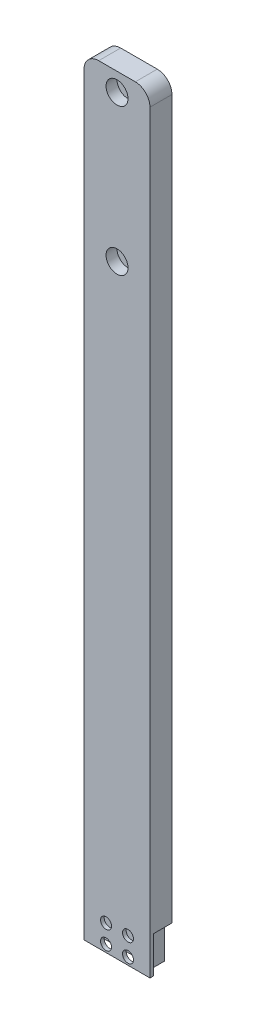
ISO-10303-21;
HEADER;
FILE_DESCRIPTION(('STEP AP214'),'2;1');
FILE_NAME('part.step','',(''),(''),'','','');
FILE_SCHEMA(('AUTOMOTIVE_DESIGN { 1 0 10303 214 1 1 1 1 }'));
ENDSEC;
DATA;
#1=APPLICATION_CONTEXT('core data for automotive mechanical design processes');
#2=APPLICATION_PROTOCOL_DEFINITION('international standard','automotive_design',2000,#1);
#3=PRODUCT_CONTEXT('',#1,'mechanical');
#4=PRODUCT('Part','Part','',(#3));
#5=PRODUCT_RELATED_PRODUCT_CATEGORY('part','',(#4));
#6=PRODUCT_DEFINITION_FORMATION('','',#4);
#7=PRODUCT_DEFINITION_CONTEXT('part definition',#1,'design');
#8=PRODUCT_DEFINITION('design','',#6,#7);
#9=PRODUCT_DEFINITION_SHAPE('','',#8);
#10=(LENGTH_UNIT() NAMED_UNIT(*) SI_UNIT(.MILLI.,.METRE.));
#11=(NAMED_UNIT(*) PLANE_ANGLE_UNIT() SI_UNIT($,.RADIAN.));
#12=(NAMED_UNIT(*) SI_UNIT($,.STERADIAN.) SOLID_ANGLE_UNIT());
#13=UNCERTAINTY_MEASURE_WITH_UNIT(LENGTH_MEASURE(1.E-05),#10,'distance_accuracy_value','');
#14=(GEOMETRIC_REPRESENTATION_CONTEXT(3) GLOBAL_UNCERTAINTY_ASSIGNED_CONTEXT((#13)) GLOBAL_UNIT_ASSIGNED_CONTEXT((#10,
#11,#12)) REPRESENTATION_CONTEXT('',''));
#15=CARTESIAN_POINT('',(0.,0.,0.));
#16=DIRECTION('',(0.,0.,1.));
#17=DIRECTION('',(1.,0.,0.));
#18=AXIS2_PLACEMENT_3D('',#15,#16,#17);
#19=CARTESIAN_POINT('',(-33.0923076923077,101.830769230769,6.));
#20=DIRECTION('',(0.,0.,-1.));
#21=DIRECTION('',(-1.,0.,0.));
#22=AXIS2_PLACEMENT_3D('',#19,#20,#21);
#23=CYLINDRICAL_SURFACE('',#22,3.);
#24=CARTESIAN_POINT('',(-33.0923076923077,101.830769230769,6.));
#25=DIRECTION('',(0.,0.,1.));
#26=DIRECTION('',(1.,0.,0.));
#27=AXIS2_PLACEMENT_3D('',#24,#25,#26);
#28=CIRCLE('',#27,3.);
#29=CARTESIAN_POINT('',(-30.0923076923077,101.830769230769,6.));
#30=VERTEX_POINT('',#29);
#31=EDGE_CURVE('E188',#30,#30,#28,.T.);
#32=ORIENTED_EDGE('',*,*,#31,.T.);
#33=EDGE_LOOP('',(#32));
#34=FACE_BOUND('',#33,.T.);
#35=CARTESIAN_POINT('',(-33.0923076923077,101.830769230769,3.00000000000002));
#36=DIRECTION('',(0.,0.,-1.));
#37=DIRECTION('',(-1.,0.,0.));
#38=AXIS2_PLACEMENT_3D('',#35,#36,#37);
#39=CIRCLE('',#38,2.99999999999999);
#40=CARTESIAN_POINT('',(-36.0923076923077,101.830769230769,3.00000000000002));
#41=VERTEX_POINT('',#40);
#42=EDGE_CURVE('E576',#41,#41,#39,.T.);
#43=ORIENTED_EDGE('',*,*,#42,.T.);
#44=EDGE_LOOP('',(#43));
#45=FACE_BOUND('',#44,.T.);
#46=ADVANCED_FACE('F33',(#34,#45),#23,.F.);
#47=CARTESIAN_POINT('',(-33.0923076923077,141.830769230769,6.));
#48=DIRECTION('',(0.,0.,-1.));
#49=DIRECTION('',(-1.,0.,0.));
#50=AXIS2_PLACEMENT_3D('',#47,#48,#49);
#51=CYLINDRICAL_SURFACE('',#50,3.);
#52=CARTESIAN_POINT('',(-33.0923076923077,141.830769230769,6.));
#53=DIRECTION('',(0.,0.,1.));
#54=DIRECTION('',(1.,0.,0.));
#55=AXIS2_PLACEMENT_3D('',#52,#53,#54);
#56=CIRCLE('',#55,3.);
#57=CARTESIAN_POINT('',(-30.0923076923077,141.830769230769,6.));
#58=VERTEX_POINT('',#57);
#59=EDGE_CURVE('E191',#58,#58,#56,.T.);
#60=ORIENTED_EDGE('',*,*,#59,.T.);
#61=EDGE_LOOP('',(#60));
#62=FACE_BOUND('',#61,.T.);
#63=CARTESIAN_POINT('',(-33.0923076923077,141.830769230769,3.00000000000002));
#64=DIRECTION('',(0.,0.,-1.));
#65=DIRECTION('',(-1.,0.,0.));
#66=AXIS2_PLACEMENT_3D('',#63,#64,#65);
#67=CIRCLE('',#66,2.99999999999999);
#68=CARTESIAN_POINT('',(-36.0923076923077,141.830769230769,3.00000000000002));
#69=VERTEX_POINT('',#68);
#70=EDGE_CURVE('E573',#69,#69,#67,.T.);
#71=ORIENTED_EDGE('',*,*,#70,.T.);
#72=EDGE_LOOP('',(#71));
#73=FACE_BOUND('',#72,.T.);
#74=ADVANCED_FACE('F293',(#62,#73),#51,.F.);
#75=CARTESIAN_POINT('',(-42.0923076923077,-53.1692307692308,6.));
#76=DIRECTION('',(0.,1.,0.));
#77=DIRECTION('',(0.,0.,1.));
#78=AXIS2_PLACEMENT_3D('',#75,#76,#77);
#79=PLANE('',#78);
#80=DIRECTION('',(-1.,0.,0.));
#81=VECTOR('',#80,1.);
#82=CARTESIAN_POINT('',(-42.0923076923077,-53.1692307692308,5.));
#83=LINE('',#82,#81);
#84=CARTESIAN_POINT('',(-24.0923076923077,-53.1692307692308,5.));
#85=VERTEX_POINT('',#84);
#86=CARTESIAN_POINT('',(-42.0923076923077,-53.1692307692308,5.));
#87=VERTEX_POINT('',#86);
#88=EDGE_CURVE('E135',#85,#87,#83,.T.);
#89=ORIENTED_EDGE('',*,*,#88,.T.);
#90=DIRECTION('',(0.,0.,-1.));
#91=VECTOR('',#90,1.);
#92=CARTESIAN_POINT('',(-42.0923076923077,-53.1692307692308,6.));
#93=LINE('',#92,#91);
#94=CARTESIAN_POINT('',(-42.0923076923077,-53.1692307692308,0.));
#95=VERTEX_POINT('',#94);
#96=EDGE_CURVE('E148',#87,#95,#93,.T.);
#97=ORIENTED_EDGE('',*,*,#96,.T.);
#98=DIRECTION('',(1.,0.,0.));
#99=VECTOR('',#98,1.);
#100=CARTESIAN_POINT('',(-42.0923076923077,-53.1692307692308,0.));
#101=LINE('',#100,#99);
#102=CARTESIAN_POINT('',(-40.0923076923077,-53.1692307692308,0.));
#103=VERTEX_POINT('',#102);
#104=EDGE_CURVE('E205',#95,#103,#101,.T.);
#105=ORIENTED_EDGE('',*,*,#104,.T.);
#106=DIRECTION('',(0.,0.,-1.));
#107=VECTOR('',#106,1.);
#108=CARTESIAN_POINT('',(-40.0923076923077,-53.1692307692308,0.));
#109=LINE('',#108,#107);
#110=CARTESIAN_POINT('',(-40.0923076923077,-53.1692307692308,3.));
#111=VERTEX_POINT('',#110);
#112=EDGE_CURVE('E173',#111,#103,#109,.T.);
#113=ORIENTED_EDGE('',*,*,#112,.F.);
#114=DIRECTION('',(-1.,0.,0.));
#115=VECTOR('',#114,1.);
#116=CARTESIAN_POINT('',(0.,-53.1692307692308,3.));
#117=LINE('',#116,#115);
#118=CARTESIAN_POINT('',(-26.0923076923077,-53.1692307692308,3.));
#119=VERTEX_POINT('',#118);
#120=EDGE_CURVE('E157',#119,#111,#117,.T.);
#121=ORIENTED_EDGE('',*,*,#120,.F.);
#122=DIRECTION('',(0.,0.,-1.));
#123=VECTOR('',#122,1.);
#124=CARTESIAN_POINT('',(-26.0923076923077,-53.1692307692308,0.));
#125=LINE('',#124,#123);
#126=CARTESIAN_POINT('',(-26.0923076923077,-53.1692307692308,0.));
#127=VERTEX_POINT('',#126);
#128=EDGE_CURVE('E163',#119,#127,#125,.T.);
#129=ORIENTED_EDGE('',*,*,#128,.T.);
#130=CARTESIAN_POINT('',(-24.0923076923077,-53.1692307692308,0.));
#131=VERTEX_POINT('',#130);
#132=EDGE_CURVE('E204',#127,#131,#101,.T.);
#133=ORIENTED_EDGE('',*,*,#132,.T.);
#134=DIRECTION('',(0.,0.,-1.));
#135=VECTOR('',#134,1.);
#136=CARTESIAN_POINT('',(-24.0923076923077,-53.1692307692308,6.));
#137=LINE('',#136,#135);
#138=EDGE_CURVE('E202',#85,#131,#137,.T.);
#139=ORIENTED_EDGE('',*,*,#138,.F.);
#140=EDGE_LOOP('',(#89,#97,#105,#113,#121,#129,#133,#139));
#141=FACE_BOUND('',#140,.T.);
#142=ADVANCED_FACE('F262',(#141),#79,.F.);
#143=CARTESIAN_POINT('',(0.,0.,6.));
#144=DIRECTION('',(0.,0.,1.));
#145=DIRECTION('',(1.,0.,0.));
#146=AXIS2_PLACEMENT_3D('',#143,#144,#145);
#147=PLANE('',#146);
#148=CARTESIAN_POINT('',(-36.0923076923077,-56.1692307692308,6.));
#149=DIRECTION('',(0.,0.,1.));
#150=DIRECTION('',(1.,0.,0.));
#151=AXIS2_PLACEMENT_3D('',#148,#149,#150);
#152=CIRCLE('',#151,1.5);
#153=CARTESIAN_POINT('',(-34.5923076923077,-56.1692307692308,6.));
#154=VERTEX_POINT('',#153);
#155=EDGE_CURVE('E150',#154,#154,#152,.T.);
#156=ORIENTED_EDGE('',*,*,#155,.F.);
#157=EDGE_LOOP('',(#156));
#158=FACE_BOUND('',#157,.T.);
#159=CARTESIAN_POINT('',(-30.0923076923077,-61.1692307692308,6.));
#160=DIRECTION('',(0.,0.,1.));
#161=DIRECTION('',(1.,0.,0.));
#162=AXIS2_PLACEMENT_3D('',#159,#160,#161);
#163=CIRCLE('',#162,1.5);
#164=CARTESIAN_POINT('',(-28.5923076923077,-61.1692307692308,6.));
#165=VERTEX_POINT('',#164);
#166=EDGE_CURVE('E233',#165,#165,#163,.T.);
#167=ORIENTED_EDGE('',*,*,#166,.F.);
#168=EDGE_LOOP('',(#167));
#169=FACE_BOUND('',#168,.T.);
#170=CARTESIAN_POINT('',(-36.0923076923077,-61.1692307692308,6.));
#171=DIRECTION('',(0.,0.,1.));
#172=DIRECTION('',(1.,0.,0.));
#173=AXIS2_PLACEMENT_3D('',#170,#171,#172);
#174=CIRCLE('',#173,1.5);
#175=CARTESIAN_POINT('',(-34.5923076923077,-61.1692307692308,6.));
#176=VERTEX_POINT('',#175);
#177=EDGE_CURVE('E228',#176,#176,#174,.T.);
#178=ORIENTED_EDGE('',*,*,#177,.F.);
#179=EDGE_LOOP('',(#178));
#180=FACE_BOUND('',#179,.T.);
#181=CARTESIAN_POINT('',(-30.0923076923077,-56.1692307692308,6.));
#182=DIRECTION('',(0.,0.,1.));
#183=DIRECTION('',(1.,0.,0.));
#184=AXIS2_PLACEMENT_3D('',#181,#182,#183);
#185=CIRCLE('',#184,1.5);
#186=CARTESIAN_POINT('',(-28.5923076923077,-56.1692307692308,6.));
#187=VERTEX_POINT('',#186);
#188=EDGE_CURVE('E223',#187,#187,#185,.T.);
#189=ORIENTED_EDGE('',*,*,#188,.F.);
#190=EDGE_LOOP('',(#189));
#191=FACE_BOUND('',#190,.T.);
#192=ORIENTED_EDGE('',*,*,#59,.F.);
#193=EDGE_LOOP('',(#192));
#194=FACE_BOUND('',#193,.T.);
#195=DIRECTION('',(0.,1.,0.));
#196=VECTOR('',#195,1.);
#197=CARTESIAN_POINT('',(-24.0923076923077,146.830769230769,6.));
#198=LINE('',#197,#196);
#199=CARTESIAN_POINT('',(-24.0923076923077,-63.1692307692308,6.));
#200=VERTEX_POINT('',#199);
#201=CARTESIAN_POINT('',(-24.0923076923077,142.830769230769,6.));
#202=VERTEX_POINT('',#201);
#203=EDGE_CURVE('E197',#200,#202,#198,.T.);
#204=ORIENTED_EDGE('',*,*,#203,.T.);
#205=CARTESIAN_POINT('',(-28.0923076923077,142.830769230769,6.));
#206=DIRECTION('',(0.,0.,1.));
#207=DIRECTION('',(1.,0.,0.));
#208=AXIS2_PLACEMENT_3D('',#205,#206,#207);
#209=CIRCLE('',#208,4.);
#210=CARTESIAN_POINT('',(-28.0923076923077,146.830769230769,6.));
#211=VERTEX_POINT('',#210);
#212=EDGE_CURVE('E41',#202,#211,#209,.T.);
#213=ORIENTED_EDGE('',*,*,#212,.T.);
#214=DIRECTION('',(-1.,0.,0.));
#215=VECTOR('',#214,1.);
#216=CARTESIAN_POINT('',(-42.0923076923077,146.830769230769,6.));
#217=LINE('',#216,#215);
#218=CARTESIAN_POINT('',(-38.0923076923077,146.830769230769,6.));
#219=VERTEX_POINT('',#218);
#220=EDGE_CURVE('E200',#211,#219,#217,.T.);
#221=ORIENTED_EDGE('',*,*,#220,.T.);
#222=CARTESIAN_POINT('',(-38.0923076923077,142.830769230769,6.));
#223=DIRECTION('',(0.,0.,1.));
#224=DIRECTION('',(1.,0.,0.));
#225=AXIS2_PLACEMENT_3D('',#222,#223,#224);
#226=CIRCLE('',#225,4.);
#227=CARTESIAN_POINT('',(-42.0923076923077,142.830769230769,6.));
#228=VERTEX_POINT('',#227);
#229=EDGE_CURVE('E48',#219,#228,#226,.T.);
#230=ORIENTED_EDGE('',*,*,#229,.T.);
#231=DIRECTION('',(0.,-1.,0.));
#232=VECTOR('',#231,1.);
#233=CARTESIAN_POINT('',(-42.0923076923077,146.830769230769,6.));
#234=LINE('',#233,#232);
#235=CARTESIAN_POINT('',(-42.0923076923077,-63.1692307692308,6.));
#236=VERTEX_POINT('',#235);
#237=EDGE_CURVE('E195',#228,#236,#234,.T.);
#238=ORIENTED_EDGE('',*,*,#237,.T.);
#239=DIRECTION('',(1.,0.,0.));
#240=VECTOR('',#239,1.);
#241=CARTESIAN_POINT('',(-42.0923076923077,-63.1692307692308,6.));
#242=LINE('',#241,#240);
#243=EDGE_CURVE('E131',#236,#200,#242,.T.);
#244=ORIENTED_EDGE('',*,*,#243,.T.);
#245=EDGE_LOOP('',(#204,#213,#221,#230,#238,#244));
#246=FACE_BOUND('',#245,.T.);
#247=ORIENTED_EDGE('',*,*,#31,.F.);
#248=EDGE_LOOP('',(#247));
#249=FACE_BOUND('',#248,.T.);
#250=ADVANCED_FACE('F245',(#158,#169,#180,#191,#194,#246,#249),#147,.T.);
#251=CARTESIAN_POINT('',(0.,0.,0.));
#252=DIRECTION('',(0.,0.,1.));
#253=DIRECTION('',(1.,0.,0.));
#254=AXIS2_PLACEMENT_3D('',#251,#252,#253);
#255=PLANE('',#254);
#256=CARTESIAN_POINT('',(-36.0923076923077,-56.1692307692308,0.));
#257=DIRECTION('',(0.,0.,-1.));
#258=DIRECTION('',(-1.,0.,0.));
#259=AXIS2_PLACEMENT_3D('',#256,#257,#258);
#260=CIRCLE('',#259,1.5);
#261=CARTESIAN_POINT('',(-37.5923076923077,-56.1692307692308,0.));
#262=VERTEX_POINT('',#261);
#263=EDGE_CURVE('E564',#262,#262,#260,.T.);
#264=ORIENTED_EDGE('',*,*,#263,.F.);
#265=EDGE_LOOP('',(#264));
#266=FACE_BOUND('',#265,.T.);
#267=CARTESIAN_POINT('',(-30.0923076923077,-61.1692307692308,0.));
#268=DIRECTION('',(0.,0.,-1.));
#269=DIRECTION('',(-1.,0.,0.));
#270=AXIS2_PLACEMENT_3D('',#267,#268,#269);
#271=CIRCLE('',#270,1.5);
#272=CARTESIAN_POINT('',(-31.5923076923077,-61.1692307692308,0.));
#273=VERTEX_POINT('',#272);
#274=EDGE_CURVE('E565',#273,#273,#271,.T.);
#275=ORIENTED_EDGE('',*,*,#274,.F.);
#276=EDGE_LOOP('',(#275));
#277=FACE_BOUND('',#276,.T.);
#278=CARTESIAN_POINT('',(-36.0923076923077,-61.1692307692308,0.));
#279=DIRECTION('',(0.,0.,-1.));
#280=DIRECTION('',(-1.,0.,0.));
#281=AXIS2_PLACEMENT_3D('',#278,#279,#280);
#282=CIRCLE('',#281,1.5);
#283=CARTESIAN_POINT('',(-37.5923076923077,-61.1692307692308,0.));
#284=VERTEX_POINT('',#283);
#285=EDGE_CURVE('E568',#284,#284,#282,.T.);
#286=ORIENTED_EDGE('',*,*,#285,.F.);
#287=EDGE_LOOP('',(#286));
#288=FACE_BOUND('',#287,.T.);
#289=CARTESIAN_POINT('',(-30.0923076923077,-56.1692307692308,0.));
#290=DIRECTION('',(0.,0.,-1.));
#291=DIRECTION('',(-1.,0.,0.));
#292=AXIS2_PLACEMENT_3D('',#289,#290,#291);
#293=CIRCLE('',#292,1.5);
#294=CARTESIAN_POINT('',(-31.5923076923077,-56.1692307692308,0.));
#295=VERTEX_POINT('',#294);
#296=EDGE_CURVE('E218',#295,#295,#293,.T.);
#297=ORIENTED_EDGE('',*,*,#296,.F.);
#298=EDGE_LOOP('',(#297));
#299=FACE_BOUND('',#298,.T.);
#300=DIRECTION('',(-1.,0.,0.));
#301=VECTOR('',#300,1.);
#302=CARTESIAN_POINT('',(-42.0923076923077,146.830769230769,0.));
#303=LINE('',#302,#301);
#304=CARTESIAN_POINT('',(-28.0923076923077,146.830769230769,0.));
#305=VERTEX_POINT('',#304);
#306=CARTESIAN_POINT('',(-38.0923076923077,146.830769230769,0.));
#307=VERTEX_POINT('',#306);
#308=EDGE_CURVE('E198',#305,#307,#303,.T.);
#309=ORIENTED_EDGE('',*,*,#308,.F.);
#310=CARTESIAN_POINT('',(-28.0923076923077,142.830769230769,0.));
#311=DIRECTION('',(0.,0.,1.));
#312=DIRECTION('',(1.,0.,0.));
#313=AXIS2_PLACEMENT_3D('',#310,#311,#312);
#314=CIRCLE('',#313,4.);
#315=CARTESIAN_POINT('',(-24.0923076923077,142.830769230769,0.));
#316=VERTEX_POINT('',#315);
#317=EDGE_CURVE('E240',#305,#316,#314,.F.);
#318=ORIENTED_EDGE('',*,*,#317,.T.);
#319=DIRECTION('',(0.,1.,0.));
#320=VECTOR('',#319,1.);
#321=CARTESIAN_POINT('',(-24.0923076923077,146.830769230769,0.));
#322=LINE('',#321,#320);
#323=EDGE_CURVE('E207',#131,#316,#322,.T.);
#324=ORIENTED_EDGE('',*,*,#323,.F.);
#325=ORIENTED_EDGE('',*,*,#132,.F.);
#326=DIRECTION('',(0.,1.,0.));
#327=VECTOR('',#326,1.);
#328=CARTESIAN_POINT('',(-26.0923076923077,-63.1692307692308,0.));
#329=LINE('',#328,#327);
#330=CARTESIAN_POINT('',(-26.0923076923077,-63.1692307692308,0.));
#331=VERTEX_POINT('',#330);
#332=EDGE_CURVE('E179',#331,#127,#329,.T.);
#333=ORIENTED_EDGE('',*,*,#332,.F.);
#334=DIRECTION('',(1.,0.,0.));
#335=VECTOR('',#334,1.);
#336=CARTESIAN_POINT('',(0.,-63.1692307692308,0.));
#337=LINE('',#336,#335);
#338=CARTESIAN_POINT('',(-40.0923076923077,-63.1692307692308,0.));
#339=VERTEX_POINT('',#338);
#340=EDGE_CURVE('E165',#339,#331,#337,.T.);
#341=ORIENTED_EDGE('',*,*,#340,.F.);
#342=DIRECTION('',(0.,1.,0.));
#343=VECTOR('',#342,1.);
#344=CARTESIAN_POINT('',(-40.0923076923077,-63.1692307692308,0.));
#345=LINE('',#344,#343);
#346=EDGE_CURVE('E182',#339,#103,#345,.T.);
#347=ORIENTED_EDGE('',*,*,#346,.T.);
#348=ORIENTED_EDGE('',*,*,#104,.F.);
#349=DIRECTION('',(0.,-1.,0.));
#350=VECTOR('',#349,1.);
#351=CARTESIAN_POINT('',(-42.0923076923077,146.830769230769,0.));
#352=LINE('',#351,#350);
#353=CARTESIAN_POINT('',(-42.0923076923077,142.830769230769,0.));
#354=VERTEX_POINT('',#353);
#355=EDGE_CURVE('E194',#354,#95,#352,.T.);
#356=ORIENTED_EDGE('',*,*,#355,.F.);
#357=CARTESIAN_POINT('',(-38.0923076923077,142.830769230769,0.));
#358=DIRECTION('',(0.,0.,1.));
#359=DIRECTION('',(1.,0.,0.));
#360=AXIS2_PLACEMENT_3D('',#357,#358,#359);
#361=CIRCLE('',#360,4.);
#362=EDGE_CURVE('E238',#354,#307,#361,.F.);
#363=ORIENTED_EDGE('',*,*,#362,.T.);
#364=EDGE_LOOP('',(#309,#318,#324,#325,#333,#341,#347,#348,#356,#363));
#365=FACE_BOUND('',#364,.T.);
#366=ADVANCED_FACE('F256',(#266,#277,#288,#299,#365),#255,.F.);
#367=CARTESIAN_POINT('',(-42.0923076923077,146.830769230769,6.));
#368=DIRECTION('',(1.,0.,0.));
#369=DIRECTION('',(0.,1.,0.));
#370=AXIS2_PLACEMENT_3D('',#367,#368,#369);
#371=PLANE('',#370);
#372=ORIENTED_EDGE('',*,*,#237,.F.);
#373=DIRECTION('',(0.,0.,-1.));
#374=VECTOR('',#373,1.);
#375=CARTESIAN_POINT('',(-42.0923076923077,142.830769230769,6.));
#376=LINE('',#375,#374);
#377=EDGE_CURVE('E11',#228,#354,#376,.T.);
#378=ORIENTED_EDGE('',*,*,#377,.T.);
#379=ORIENTED_EDGE('',*,*,#355,.T.);
#380=ORIENTED_EDGE('',*,*,#96,.F.);
#381=DIRECTION('',(0.,-1.,0.));
#382=VECTOR('',#381,1.);
#383=CARTESIAN_POINT('',(-42.0923076923077,-53.1692307692308,5.));
#384=LINE('',#383,#382);
#385=CARTESIAN_POINT('',(-42.0923076923077,-63.1692307692308,5.));
#386=VERTEX_POINT('',#385);
#387=EDGE_CURVE('E140',#87,#386,#384,.T.);
#388=ORIENTED_EDGE('',*,*,#387,.T.);
#389=DIRECTION('',(0.,0.,1.));
#390=VECTOR('',#389,1.);
#391=CARTESIAN_POINT('',(-42.0923076923077,-63.1692307692308,5.));
#392=LINE('',#391,#390);
#393=EDGE_CURVE('E125',#386,#236,#392,.T.);
#394=ORIENTED_EDGE('',*,*,#393,.T.);
#395=EDGE_LOOP('',(#372,#378,#379,#380,#388,#394));
#396=FACE_BOUND('',#395,.T.);
#397=ADVANCED_FACE('F146',(#396),#371,.F.);
#398=CARTESIAN_POINT('',(-24.0923076923077,146.830769230769,6.));
#399=DIRECTION('',(-1.,0.,0.));
#400=DIRECTION('',(0.,-1.,0.));
#401=AXIS2_PLACEMENT_3D('',#398,#399,#400);
#402=PLANE('',#401);
#403=ORIENTED_EDGE('',*,*,#323,.T.);
#404=DIRECTION('',(0.,0.,-1.));
#405=VECTOR('',#404,1.);
#406=CARTESIAN_POINT('',(-24.0923076923077,142.830769230769,6.));
#407=LINE('',#406,#405);
#408=EDGE_CURVE('E56',#316,#202,#407,.F.);
#409=ORIENTED_EDGE('',*,*,#408,.T.);
#410=ORIENTED_EDGE('',*,*,#203,.F.);
#411=DIRECTION('',(0.,0.,1.));
#412=VECTOR('',#411,1.);
#413=CARTESIAN_POINT('',(-24.0923076923077,-63.1692307692308,5.));
#414=LINE('',#413,#412);
#415=CARTESIAN_POINT('',(-24.0923076923077,-63.1692307692308,5.));
#416=VERTEX_POINT('',#415);
#417=EDGE_CURVE('E134',#416,#200,#414,.T.);
#418=ORIENTED_EDGE('',*,*,#417,.F.);
#419=DIRECTION('',(0.,1.,0.));
#420=VECTOR('',#419,1.);
#421=CARTESIAN_POINT('',(-24.0923076923077,-53.1692307692308,5.));
#422=LINE('',#421,#420);
#423=EDGE_CURVE('E143',#416,#85,#422,.T.);
#424=ORIENTED_EDGE('',*,*,#423,.T.);
#425=ORIENTED_EDGE('',*,*,#138,.T.);
#426=EDGE_LOOP('',(#403,#409,#410,#418,#424,#425));
#427=FACE_BOUND('',#426,.T.);
#428=ADVANCED_FACE('F258',(#427),#402,.F.);
#429=CARTESIAN_POINT('',(-42.0923076923077,146.830769230769,6.));
#430=DIRECTION('',(0.,-1.,0.));
#431=DIRECTION('',(0.,0.,-1.));
#432=AXIS2_PLACEMENT_3D('',#429,#430,#431);
#433=PLANE('',#432);
#434=ORIENTED_EDGE('',*,*,#220,.F.);
#435=DIRECTION('',(0.,0.,-1.));
#436=VECTOR('',#435,1.);
#437=CARTESIAN_POINT('',(-28.0923076923077,146.830769230769,6.));
#438=LINE('',#437,#436);
#439=EDGE_CURVE('E235',#211,#305,#438,.T.);
#440=ORIENTED_EDGE('',*,*,#439,.T.);
#441=ORIENTED_EDGE('',*,*,#308,.T.);
#442=DIRECTION('',(0.,0.,-1.));
#443=VECTOR('',#442,1.);
#444=CARTESIAN_POINT('',(-38.0923076923077,146.830769230769,6.));
#445=LINE('',#444,#443);
#446=EDGE_CURVE('E213',#307,#219,#445,.F.);
#447=ORIENTED_EDGE('',*,*,#446,.T.);
#448=EDGE_LOOP('',(#434,#440,#441,#447));
#449=FACE_BOUND('',#448,.T.);
#450=ADVANCED_FACE('F250',(#449),#433,.F.);
#451=CARTESIAN_POINT('',(0.,-63.1692307692308,3.));
#452=DIRECTION('',(0.,0.,-1.));
#453=DIRECTION('',(-1.,0.,0.));
#454=AXIS2_PLACEMENT_3D('',#451,#452,#453);
#455=PLANE('',#454);
#456=CARTESIAN_POINT('',(-36.0923076923077,-56.1692307692308,3.));
#457=DIRECTION('',(0.,0.,-1.));
#458=DIRECTION('',(-1.,0.,0.));
#459=AXIS2_PLACEMENT_3D('',#456,#457,#458);
#460=CIRCLE('',#459,1.5);
#461=CARTESIAN_POINT('',(-37.5923076923077,-56.1692307692308,3.));
#462=VERTEX_POINT('',#461);
#463=EDGE_CURVE('E232',#462,#462,#460,.T.);
#464=ORIENTED_EDGE('',*,*,#463,.T.);
#465=EDGE_LOOP('',(#464));
#466=FACE_BOUND('',#465,.T.);
#467=CARTESIAN_POINT('',(-30.0923076923077,-61.1692307692308,3.));
#468=DIRECTION('',(0.,0.,-1.));
#469=DIRECTION('',(-1.,0.,0.));
#470=AXIS2_PLACEMENT_3D('',#467,#468,#469);
#471=CIRCLE('',#470,1.5);
#472=CARTESIAN_POINT('',(-31.5923076923077,-61.1692307692308,3.));
#473=VERTEX_POINT('',#472);
#474=EDGE_CURVE('E227',#473,#473,#471,.T.);
#475=ORIENTED_EDGE('',*,*,#474,.T.);
#476=EDGE_LOOP('',(#475));
#477=FACE_BOUND('',#476,.T.);
#478=CARTESIAN_POINT('',(-36.0923076923077,-61.1692307692308,3.));
#479=DIRECTION('',(0.,0.,-1.));
#480=DIRECTION('',(-1.,0.,0.));
#481=AXIS2_PLACEMENT_3D('',#478,#479,#480);
#482=CIRCLE('',#481,1.5);
#483=CARTESIAN_POINT('',(-37.5923076923077,-61.1692307692308,3.));
#484=VERTEX_POINT('',#483);
#485=EDGE_CURVE('E222',#484,#484,#482,.T.);
#486=ORIENTED_EDGE('',*,*,#485,.T.);
#487=EDGE_LOOP('',(#486));
#488=FACE_BOUND('',#487,.T.);
#489=CARTESIAN_POINT('',(-30.0923076923077,-56.1692307692308,3.));
#490=DIRECTION('',(0.,0.,-1.));
#491=DIRECTION('',(-1.,0.,0.));
#492=AXIS2_PLACEMENT_3D('',#489,#490,#491);
#493=CIRCLE('',#492,1.5);
#494=CARTESIAN_POINT('',(-31.5923076923077,-56.1692307692308,3.));
#495=VERTEX_POINT('',#494);
#496=EDGE_CURVE('E217',#495,#495,#493,.T.);
#497=ORIENTED_EDGE('',*,*,#496,.T.);
#498=EDGE_LOOP('',(#497));
#499=FACE_BOUND('',#498,.T.);
#500=ORIENTED_EDGE('',*,*,#120,.T.);
#501=DIRECTION('',(0.,1.,0.));
#502=VECTOR('',#501,1.);
#503=CARTESIAN_POINT('',(-40.0923076923077,-63.1692307692308,3.));
#504=LINE('',#503,#502);
#505=CARTESIAN_POINT('',(-40.0923076923077,-63.1692307692308,3.));
#506=VERTEX_POINT('',#505);
#507=EDGE_CURVE('E185',#506,#111,#504,.T.);
#508=ORIENTED_EDGE('',*,*,#507,.F.);
#509=DIRECTION('',(-1.,0.,0.));
#510=VECTOR('',#509,1.);
#511=CARTESIAN_POINT('',(0.,-63.1692307692308,3.));
#512=LINE('',#511,#510);
#513=CARTESIAN_POINT('',(-26.0923076923077,-63.1692307692308,3.));
#514=VERTEX_POINT('',#513);
#515=EDGE_CURVE('E159',#514,#506,#512,.T.);
#516=ORIENTED_EDGE('',*,*,#515,.F.);
#517=DIRECTION('',(0.,1.,0.));
#518=VECTOR('',#517,1.);
#519=CARTESIAN_POINT('',(-26.0923076923077,-63.1692307692308,3.));
#520=LINE('',#519,#518);
#521=EDGE_CURVE('E170',#514,#119,#520,.T.);
#522=ORIENTED_EDGE('',*,*,#521,.T.);
#523=EDGE_LOOP('',(#500,#508,#516,#522));
#524=FACE_BOUND('',#523,.T.);
#525=ADVANCED_FACE('F279',(#466,#477,#488,#499,#524),#455,.F.);
#526=CARTESIAN_POINT('',(-40.0923076923077,-63.1692307692308,0.));
#527=DIRECTION('',(1.,0.,0.));
#528=DIRECTION('',(0.,0.,-1.));
#529=AXIS2_PLACEMENT_3D('',#526,#527,#528);
#530=PLANE('',#529);
#531=ORIENTED_EDGE('',*,*,#112,.T.);
#532=ORIENTED_EDGE('',*,*,#346,.F.);
#533=DIRECTION('',(0.,0.,-1.));
#534=VECTOR('',#533,1.);
#535=CARTESIAN_POINT('',(-40.0923076923077,-63.1692307692308,0.));
#536=LINE('',#535,#534);
#537=EDGE_CURVE('E162',#506,#339,#536,.T.);
#538=ORIENTED_EDGE('',*,*,#537,.F.);
#539=ORIENTED_EDGE('',*,*,#507,.T.);
#540=EDGE_LOOP('',(#531,#532,#538,#539));
#541=FACE_BOUND('',#540,.T.);
#542=ADVANCED_FACE('F277',(#541),#530,.F.);
#543=CARTESIAN_POINT('',(-26.0923076923077,-63.1692307692308,0.));
#544=DIRECTION('',(1.,0.,0.));
#545=DIRECTION('',(0.,0.,-1.));
#546=AXIS2_PLACEMENT_3D('',#543,#544,#545);
#547=PLANE('',#546);
#548=ORIENTED_EDGE('',*,*,#128,.F.);
#549=ORIENTED_EDGE('',*,*,#521,.F.);
#550=DIRECTION('',(0.,0.,-1.));
#551=VECTOR('',#550,1.);
#552=CARTESIAN_POINT('',(-26.0923076923077,-63.1692307692308,0.));
#553=LINE('',#552,#551);
#554=EDGE_CURVE('E167',#514,#331,#553,.T.);
#555=ORIENTED_EDGE('',*,*,#554,.T.);
#556=ORIENTED_EDGE('',*,*,#332,.T.);
#557=EDGE_LOOP('',(#548,#549,#555,#556));
#558=FACE_BOUND('',#557,.T.);
#559=ADVANCED_FACE('F267',(#558),#547,.T.);
#560=CARTESIAN_POINT('',(0.,-63.1692307692308,0.));
#561=DIRECTION('',(0.,-1.,0.));
#562=DIRECTION('',(0.,0.,-1.));
#563=AXIS2_PLACEMENT_3D('',#560,#561,#562);
#564=PLANE('',#563);
#565=ORIENTED_EDGE('',*,*,#515,.T.);
#566=ORIENTED_EDGE('',*,*,#537,.T.);
#567=ORIENTED_EDGE('',*,*,#340,.T.);
#568=ORIENTED_EDGE('',*,*,#554,.F.);
#569=EDGE_LOOP('',(#565,#566,#567,#568));
#570=FACE_BOUND('',#569,.T.);
#571=ADVANCED_FACE('F271',(#570),#564,.T.);
#572=CARTESIAN_POINT('',(-42.0923076923077,-63.1692307692308,5.));
#573=DIRECTION('',(0.,-1.,0.));
#574=DIRECTION('',(0.,0.,-1.));
#575=AXIS2_PLACEMENT_3D('',#572,#573,#574);
#576=PLANE('',#575);
#577=ORIENTED_EDGE('',*,*,#243,.F.);
#578=ORIENTED_EDGE('',*,*,#393,.F.);
#579=DIRECTION('',(1.,0.,0.));
#580=VECTOR('',#579,1.);
#581=CARTESIAN_POINT('',(-42.0923076923077,-63.1692307692308,5.));
#582=LINE('',#581,#580);
#583=EDGE_CURVE('E129',#386,#416,#582,.T.);
#584=ORIENTED_EDGE('',*,*,#583,.T.);
#585=ORIENTED_EDGE('',*,*,#417,.T.);
#586=EDGE_LOOP('',(#577,#578,#584,#585));
#587=FACE_BOUND('',#586,.T.);
#588=ADVANCED_FACE('F127',(#587),#576,.T.);
#589=CARTESIAN_POINT('',(0.,0.,5.));
#590=DIRECTION('',(0.,0.,1.));
#591=DIRECTION('',(1.,0.,0.));
#592=AXIS2_PLACEMENT_3D('',#589,#590,#591);
#593=PLANE('',#592);
#594=CARTESIAN_POINT('',(-36.0923076923077,-56.1692307692308,5.));
#595=DIRECTION('',(0.,0.,1.));
#596=DIRECTION('',(1.,0.,0.));
#597=AXIS2_PLACEMENT_3D('',#594,#595,#596);
#598=CIRCLE('',#597,1.5);
#599=CARTESIAN_POINT('',(-34.5923076923077,-56.1692307692308,5.));
#600=VERTEX_POINT('',#599);
#601=EDGE_CURVE('E229',#600,#600,#598,.T.);
#602=ORIENTED_EDGE('',*,*,#601,.T.);
#603=EDGE_LOOP('',(#602));
#604=FACE_BOUND('',#603,.T.);
#605=CARTESIAN_POINT('',(-30.0923076923077,-61.1692307692308,5.));
#606=DIRECTION('',(0.,0.,1.));
#607=DIRECTION('',(1.,0.,0.));
#608=AXIS2_PLACEMENT_3D('',#605,#606,#607);
#609=CIRCLE('',#608,1.5);
#610=CARTESIAN_POINT('',(-28.5923076923077,-61.1692307692308,5.));
#611=VERTEX_POINT('',#610);
#612=EDGE_CURVE('E224',#611,#611,#609,.T.);
#613=ORIENTED_EDGE('',*,*,#612,.T.);
#614=EDGE_LOOP('',(#613));
#615=FACE_BOUND('',#614,.T.);
#616=CARTESIAN_POINT('',(-36.0923076923077,-61.1692307692308,5.));
#617=DIRECTION('',(0.,0.,1.));
#618=DIRECTION('',(1.,0.,0.));
#619=AXIS2_PLACEMENT_3D('',#616,#617,#618);
#620=CIRCLE('',#619,1.5);
#621=CARTESIAN_POINT('',(-34.5923076923077,-61.1692307692308,5.));
#622=VERTEX_POINT('',#621);
#623=EDGE_CURVE('E219',#622,#622,#620,.T.);
#624=ORIENTED_EDGE('',*,*,#623,.T.);
#625=EDGE_LOOP('',(#624));
#626=FACE_BOUND('',#625,.T.);
#627=CARTESIAN_POINT('',(-30.0923076923077,-56.1692307692308,5.));
#628=DIRECTION('',(0.,0.,1.));
#629=DIRECTION('',(1.,0.,0.));
#630=AXIS2_PLACEMENT_3D('',#627,#628,#629);
#631=CIRCLE('',#630,1.5);
#632=CARTESIAN_POINT('',(-28.5923076923077,-56.1692307692308,5.));
#633=VERTEX_POINT('',#632);
#634=EDGE_CURVE('E214',#633,#633,#631,.T.);
#635=ORIENTED_EDGE('',*,*,#634,.T.);
#636=EDGE_LOOP('',(#635));
#637=FACE_BOUND('',#636,.T.);
#638=ORIENTED_EDGE('',*,*,#387,.F.);
#639=ORIENTED_EDGE('',*,*,#88,.F.);
#640=ORIENTED_EDGE('',*,*,#423,.F.);
#641=ORIENTED_EDGE('',*,*,#583,.F.);
#642=EDGE_LOOP('',(#638,#639,#640,#641));
#643=FACE_BOUND('',#642,.T.);
#644=ADVANCED_FACE('F139',(#604,#615,#626,#637,#643),#593,.F.);
#645=CARTESIAN_POINT('',(-30.0923076923077,-56.1692307692308,8.));
#646=DIRECTION('',(0.,0.,-1.));
#647=DIRECTION('',(-1.,0.,0.));
#648=AXIS2_PLACEMENT_3D('',#645,#646,#647);
#649=CYLINDRICAL_SURFACE('',#648,1.5);
#650=ORIENTED_EDGE('',*,*,#188,.T.);
#651=EDGE_LOOP('',(#650));
#652=FACE_BOUND('',#651,.T.);
#653=ORIENTED_EDGE('',*,*,#634,.F.);
#654=EDGE_LOOP('',(#653));
#655=FACE_BOUND('',#654,.T.);
#656=ADVANCED_FACE('F349',(#652,#655),#649,.F.);
#657=CARTESIAN_POINT('',(-36.0923076923077,-61.1692307692308,8.));
#658=DIRECTION('',(0.,0.,-1.));
#659=DIRECTION('',(-1.,0.,0.));
#660=AXIS2_PLACEMENT_3D('',#657,#658,#659);
#661=CYLINDRICAL_SURFACE('',#660,1.5);
#662=ORIENTED_EDGE('',*,*,#177,.T.);
#663=EDGE_LOOP('',(#662));
#664=FACE_BOUND('',#663,.T.);
#665=ORIENTED_EDGE('',*,*,#623,.F.);
#666=EDGE_LOOP('',(#665));
#667=FACE_BOUND('',#666,.T.);
#668=ADVANCED_FACE('F337',(#664,#667),#661,.F.);
#669=CARTESIAN_POINT('',(-30.0923076923077,-61.1692307692308,8.));
#670=DIRECTION('',(0.,0.,-1.));
#671=DIRECTION('',(-1.,0.,0.));
#672=AXIS2_PLACEMENT_3D('',#669,#670,#671);
#673=CYLINDRICAL_SURFACE('',#672,1.5);
#674=ORIENTED_EDGE('',*,*,#166,.T.);
#675=EDGE_LOOP('',(#674));
#676=FACE_BOUND('',#675,.T.);
#677=ORIENTED_EDGE('',*,*,#612,.F.);
#678=EDGE_LOOP('',(#677));
#679=FACE_BOUND('',#678,.T.);
#680=ADVANCED_FACE('F345',(#676,#679),#673,.F.);
#681=CARTESIAN_POINT('',(-36.0923076923077,-56.1692307692308,8.));
#682=DIRECTION('',(0.,0.,-1.));
#683=DIRECTION('',(-1.,0.,0.));
#684=AXIS2_PLACEMENT_3D('',#681,#682,#683);
#685=CYLINDRICAL_SURFACE('',#684,1.5);
#686=ORIENTED_EDGE('',*,*,#155,.T.);
#687=EDGE_LOOP('',(#686));
#688=FACE_BOUND('',#687,.T.);
#689=ORIENTED_EDGE('',*,*,#601,.F.);
#690=EDGE_LOOP('',(#689));
#691=FACE_BOUND('',#690,.T.);
#692=ADVANCED_FACE('F341',(#688,#691),#685,.F.);
#693=ORIENTED_EDGE('',*,*,#296,.T.);
#694=EDGE_LOOP('',(#693));
#695=FACE_BOUND('',#694,.T.);
#696=ORIENTED_EDGE('',*,*,#496,.F.);
#697=EDGE_LOOP('',(#696));
#698=FACE_BOUND('',#697,.T.);
#699=ADVANCED_FACE('F335',(#695,#698),#649,.F.);
#700=ORIENTED_EDGE('',*,*,#285,.T.);
#701=EDGE_LOOP('',(#700));
#702=FACE_BOUND('',#701,.T.);
#703=ORIENTED_EDGE('',*,*,#485,.F.);
#704=EDGE_LOOP('',(#703));
#705=FACE_BOUND('',#704,.T.);
#706=ADVANCED_FACE('F331',(#702,#705),#661,.F.);
#707=ORIENTED_EDGE('',*,*,#274,.T.);
#708=EDGE_LOOP('',(#707));
#709=FACE_BOUND('',#708,.T.);
#710=ORIENTED_EDGE('',*,*,#474,.F.);
#711=EDGE_LOOP('',(#710));
#712=FACE_BOUND('',#711,.T.);
#713=ADVANCED_FACE('F334',(#709,#712),#673,.F.);
#714=ORIENTED_EDGE('',*,*,#263,.T.);
#715=EDGE_LOOP('',(#714));
#716=FACE_BOUND('',#715,.T.);
#717=ORIENTED_EDGE('',*,*,#463,.F.);
#718=EDGE_LOOP('',(#717));
#719=FACE_BOUND('',#718,.T.);
#720=ADVANCED_FACE('F326',(#716,#719),#685,.F.);
#721=CARTESIAN_POINT('',(-33.0923076923077,141.830769230769,3.00000000000002));
#722=DIRECTION('',(0.,0.,-1.));
#723=DIRECTION('',(-1.,0.,0.));
#724=AXIS2_PLACEMENT_3D('',#721,#722,#723);
#725=PLANE('',#724);
#726=ORIENTED_EDGE('',*,*,#70,.F.);
#727=EDGE_LOOP('',(#726));
#728=FACE_BOUND('',#727,.T.);
#729=ADVANCED_FACE('F320',(#728),#725,.F.);
#730=CARTESIAN_POINT('',(-33.0923076923077,101.830769230769,3.00000000000002));
#731=DIRECTION('',(0.,0.,-1.));
#732=DIRECTION('',(-1.,0.,0.));
#733=AXIS2_PLACEMENT_3D('',#730,#731,#732);
#734=PLANE('',#733);
#735=ORIENTED_EDGE('',*,*,#42,.F.);
#736=EDGE_LOOP('',(#735));
#737=FACE_BOUND('',#736,.T.);
#738=ADVANCED_FACE('F314',(#737),#734,.F.);
#739=CARTESIAN_POINT('',(-28.0923076923077,142.830769230769,6.));
#740=DIRECTION('',(0.,0.,-1.));
#741=DIRECTION('',(-1.,0.,0.));
#742=AXIS2_PLACEMENT_3D('',#739,#740,#741);
#743=CYLINDRICAL_SURFACE('',#742,4.);
#744=ORIENTED_EDGE('',*,*,#212,.F.);
#745=ORIENTED_EDGE('',*,*,#408,.F.);
#746=ORIENTED_EDGE('',*,*,#317,.F.);
#747=ORIENTED_EDGE('',*,*,#439,.F.);
#748=EDGE_LOOP('',(#744,#745,#746,#747));
#749=FACE_BOUND('',#748,.T.);
#750=ADVANCED_FACE('F253',(#749),#743,.T.);
#751=CARTESIAN_POINT('',(-38.0923076923077,142.830769230769,6.));
#752=DIRECTION('',(0.,0.,-1.));
#753=DIRECTION('',(-1.,0.,0.));
#754=AXIS2_PLACEMENT_3D('',#751,#752,#753);
#755=CYLINDRICAL_SURFACE('',#754,4.);
#756=ORIENTED_EDGE('',*,*,#229,.F.);
#757=ORIENTED_EDGE('',*,*,#446,.F.);
#758=ORIENTED_EDGE('',*,*,#362,.F.);
#759=ORIENTED_EDGE('',*,*,#377,.F.);
#760=EDGE_LOOP('',(#756,#757,#758,#759));
#761=FACE_BOUND('',#760,.T.);
#762=ADVANCED_FACE('F35',(#761),#755,.T.);
#763=CLOSED_SHELL('',(#46,#74,#142,#250,#366,#397,#428,#450,#525,#542,#559,#571,#588,#644,#656,
#668,#680,#692,#699,#706,#713,#720,#729,#738,#750,#762));
#764=MANIFOLD_SOLID_BREP('B2',#763);
#765=ADVANCED_BREP_SHAPE_REPRESENTATION('',(#18,#764),#14);
#766=SHAPE_DEFINITION_REPRESENTATION(#9,#765);
ENDSEC;
END-ISO-10303-21;
